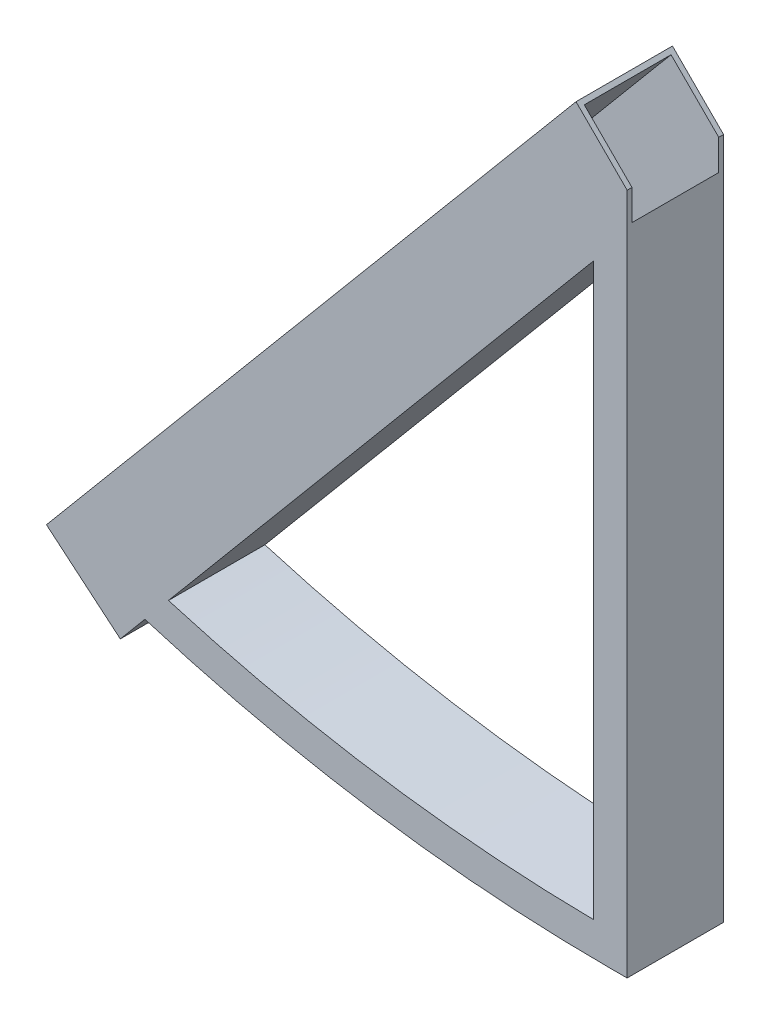
ISO-10303-21;
HEADER;
FILE_DESCRIPTION(('STEP AP214'),'2;1');
FILE_NAME('part.step','',(''),(''),'','','');
FILE_SCHEMA(('AUTOMOTIVE_DESIGN { 1 0 10303 214 1 1 1 1 }'));
ENDSEC;
DATA;
#1=APPLICATION_CONTEXT('core data for automotive mechanical design processes');
#2=APPLICATION_PROTOCOL_DEFINITION('international standard','automotive_design',2000,#1);
#3=PRODUCT_CONTEXT('',#1,'mechanical');
#4=PRODUCT('Part','Part','',(#3));
#5=PRODUCT_RELATED_PRODUCT_CATEGORY('part','',(#4));
#6=PRODUCT_DEFINITION_FORMATION('','',#4);
#7=PRODUCT_DEFINITION_CONTEXT('part definition',#1,'design');
#8=PRODUCT_DEFINITION('design','',#6,#7);
#9=PRODUCT_DEFINITION_SHAPE('','',#8);
#10=(LENGTH_UNIT() NAMED_UNIT(*) SI_UNIT(.MILLI.,.METRE.));
#11=(NAMED_UNIT(*) PLANE_ANGLE_UNIT() SI_UNIT($,.RADIAN.));
#12=(NAMED_UNIT(*) SI_UNIT($,.STERADIAN.) SOLID_ANGLE_UNIT());
#13=UNCERTAINTY_MEASURE_WITH_UNIT(LENGTH_MEASURE(1.E-05),#10,'distance_accuracy_value','');
#14=(GEOMETRIC_REPRESENTATION_CONTEXT(3) GLOBAL_UNCERTAINTY_ASSIGNED_CONTEXT((#13)) GLOBAL_UNIT_ASSIGNED_CONTEXT((#10,
#11,#12)) REPRESENTATION_CONTEXT('',''));
#15=CARTESIAN_POINT('',(0.,0.,0.));
#16=DIRECTION('',(0.,0.,1.));
#17=DIRECTION('',(1.,0.,0.));
#18=AXIS2_PLACEMENT_3D('',#15,#16,#17);
#19=CARTESIAN_POINT('',(0.,330.,-10.));
#20=DIRECTION('',(0.,0.,1.));
#21=DIRECTION('',(1.,0.,0.));
#22=AXIS2_PLACEMENT_3D('',#19,#20,#21);
#23=CYLINDRICAL_SURFACE('',#22,330.);
#24=DIRECTION('',(0.,0.,1.));
#25=VECTOR('',#24,1.);
#26=CARTESIAN_POINT('',(0.,0.,-10.));
#27=LINE('',#26,#25);
#28=CARTESIAN_POINT('',(0.,0.,-10.));
#29=VERTEX_POINT('',#28);
#30=CARTESIAN_POINT('',(0.,0.,10.));
#31=VERTEX_POINT('',#30);
#32=EDGE_CURVE('E279',#29,#31,#27,.T.);
#33=ORIENTED_EDGE('',*,*,#32,.T.);
#34=CARTESIAN_POINT('',(0.,330.,10.));
#35=DIRECTION('',(0.,0.,1.));
#36=DIRECTION('',(-1.,0.,0.));
#37=AXIS2_PLACEMENT_3D('',#34,#35,#36);
#38=CIRCLE('',#37,330.);
#39=CARTESIAN_POINT('',(-96.5092206003725,14.427551362435,10.));
#40=VERTEX_POINT('',#39);
#41=EDGE_CURVE('E202',#40,#31,#38,.T.);
#42=ORIENTED_EDGE('',*,*,#41,.F.);
#43=DIRECTION('',(0.,0.,1.));
#44=VECTOR('',#43,1.);
#45=CARTESIAN_POINT('',(-96.5092206003725,14.427551362435,-10.));
#46=LINE('',#45,#44);
#47=CARTESIAN_POINT('',(-96.5092206003725,14.427551362435,-10.));
#48=VERTEX_POINT('',#47);
#49=EDGE_CURVE('E280',#48,#40,#46,.T.);
#50=ORIENTED_EDGE('',*,*,#49,.F.);
#51=CARTESIAN_POINT('',(0.,330.,-10.));
#52=DIRECTION('',(0.,0.,1.));
#53=DIRECTION('',(-1.,0.,0.));
#54=AXIS2_PLACEMENT_3D('',#51,#52,#53);
#55=CIRCLE('',#54,330.);
#56=EDGE_CURVE('E246',#48,#29,#55,.T.);
#57=ORIENTED_EDGE('',*,*,#56,.T.);
#58=EDGE_LOOP('',(#33,#42,#50,#57));
#59=FACE_BOUND('',#58,.T.);
#60=ADVANCED_FACE('F45',(#59),#23,.T.);
#61=CARTESIAN_POINT('',(-101.613449215523,8.34456857290761,-10.));
#62=DIRECTION('',(0.766044443118983,-0.642787609686533,0.));
#63=DIRECTION('',(0.642787609686534,0.766044443118983,0.));
#64=AXIS2_PLACEMENT_3D('',#61,#62,#63);
#65=PLANE('',#64);
#66=ORIENTED_EDGE('',*,*,#49,.T.);
#67=DIRECTION('',(0.642787609686533,0.766044443118983,0.));
#68=VECTOR('',#67,1.);
#69=CARTESIAN_POINT('',(-101.613449215523,8.34456857290761,10.));
#70=LINE('',#69,#68);
#71=CARTESIAN_POINT('',(-101.613449215523,8.34456857290761,10.));
#72=VERTEX_POINT('',#71);
#73=EDGE_CURVE('E226',#72,#40,#70,.T.);
#74=ORIENTED_EDGE('',*,*,#73,.F.);
#75=DIRECTION('',(0.,0.,1.));
#76=VECTOR('',#75,1.);
#77=CARTESIAN_POINT('',(-101.613449215523,8.34456857290761,-10.));
#78=LINE('',#77,#76);
#79=CARTESIAN_POINT('',(-101.613449215523,8.34456857290761,-10.));
#80=VERTEX_POINT('',#79);
#81=EDGE_CURVE('E284',#80,#72,#78,.T.);
#82=ORIENTED_EDGE('',*,*,#81,.F.);
#83=DIRECTION('',(0.642787609686533,0.766044443118983,0.));
#84=VECTOR('',#83,1.);
#85=CARTESIAN_POINT('',(-101.613449215523,8.34456857290761,-10.));
#86=LINE('',#85,#84);
#87=EDGE_CURVE('E275',#80,#48,#86,.T.);
#88=ORIENTED_EDGE('',*,*,#87,.T.);
#89=EDGE_LOOP('',(#66,#74,#82,#88));
#90=FACE_BOUND('',#89,.T.);
#91=ADVANCED_FACE('F330',(#90),#65,.T.);
#92=CARTESIAN_POINT('',(-116.934338077902,21.2003207666383,-10.));
#93=DIRECTION('',(-0.642787609686534,-0.766044443118982,0.));
#94=DIRECTION('',(0.766044443118982,-0.642787609686534,0.));
#95=AXIS2_PLACEMENT_3D('',#92,#93,#94);
#96=PLANE('',#95);
#97=DIRECTION('',(0.,0.,1.));
#98=VECTOR('',#97,1.);
#99=CARTESIAN_POINT('',(-102.379493658642,8.98735618259415,-10.));
#100=LINE('',#99,#98);
#101=CARTESIAN_POINT('',(-102.379493658642,8.98735618259414,-8.99999999999999));
#102=VERTEX_POINT('',#101);
#103=CARTESIAN_POINT('',(-102.379493658642,8.98735618259414,8.99999999999999));
#104=VERTEX_POINT('',#103);
#105=EDGE_CURVE('E184',#102,#104,#100,.T.);
#106=ORIENTED_EDGE('',*,*,#105,.F.);
#107=DIRECTION('',(0.766044443118982,-0.642787609686534,0.));
#108=VECTOR('',#107,1.);
#109=CARTESIAN_POINT('',(-116.934338077902,21.2003207666383,-8.99999999999999));
#110=LINE('',#109,#108);
#111=CARTESIAN_POINT('',(-116.168293634783,20.5575331569517,-8.99999999999999));
#112=VERTEX_POINT('',#111);
#113=EDGE_CURVE('E181',#112,#102,#110,.T.);
#114=ORIENTED_EDGE('',*,*,#113,.F.);
#115=DIRECTION('',(0.,0.,-1.));
#116=VECTOR('',#115,1.);
#117=CARTESIAN_POINT('',(-116.168293634783,20.5575331569518,-10.));
#118=LINE('',#117,#116);
#119=CARTESIAN_POINT('',(-116.168293634783,20.5575331569518,8.99999999999999));
#120=VERTEX_POINT('',#119);
#121=EDGE_CURVE('E187',#120,#112,#118,.T.);
#122=ORIENTED_EDGE('',*,*,#121,.F.);
#123=DIRECTION('',(-0.766044443118982,0.642787609686534,0.));
#124=VECTOR('',#123,1.);
#125=CARTESIAN_POINT('',(-116.934338077902,21.2003207666383,8.99999999999999));
#126=LINE('',#125,#124);
#127=EDGE_CURVE('E161',#104,#120,#126,.T.);
#128=ORIENTED_EDGE('',*,*,#127,.F.);
#129=EDGE_LOOP('',(#106,#114,#122,#128));
#130=FACE_BOUND('',#129,.T.);
#131=ORIENTED_EDGE('',*,*,#81,.T.);
#132=DIRECTION('',(0.766044443118982,-0.642787609686534,0.));
#133=VECTOR('',#132,1.);
#134=CARTESIAN_POINT('',(-116.934338077902,21.2003207666383,10.));
#135=LINE('',#134,#133);
#136=CARTESIAN_POINT('',(-116.934338077902,21.2003207666383,10.));
#137=VERTEX_POINT('',#136);
#138=EDGE_CURVE('E222',#137,#72,#135,.T.);
#139=ORIENTED_EDGE('',*,*,#138,.F.);
#140=DIRECTION('',(0.,0.,1.));
#141=VECTOR('',#140,1.);
#142=CARTESIAN_POINT('',(-116.934338077902,21.2003207666383,-10.));
#143=LINE('',#142,#141);
#144=CARTESIAN_POINT('',(-116.934338077902,21.2003207666383,-10.));
#145=VERTEX_POINT('',#144);
#146=EDGE_CURVE('E287',#145,#137,#143,.T.);
#147=ORIENTED_EDGE('',*,*,#146,.F.);
#148=DIRECTION('',(0.766044443118982,-0.642787609686534,0.));
#149=VECTOR('',#148,1.);
#150=CARTESIAN_POINT('',(-116.934338077902,21.2003207666383,-10.));
#151=LINE('',#150,#149);
#152=EDGE_CURVE('E271',#145,#80,#151,.T.);
#153=ORIENTED_EDGE('',*,*,#152,.T.);
#154=EDGE_LOOP('',(#131,#139,#147,#153));
#155=FACE_BOUND('',#154,.T.);
#156=ADVANCED_FACE('F334',(#130,#155),#96,.T.);
#157=CARTESIAN_POINT('',(-7.09807814216643,152.098078142165,-10.));
#158=DIRECTION('',(-0.766044443118982,0.642787609686534,0.));
#159=DIRECTION('',(-0.642787609686534,-0.766044443118982,0.));
#160=AXIS2_PLACEMENT_3D('',#157,#158,#159);
#161=PLANE('',#160);
#162=ORIENTED_EDGE('',*,*,#146,.T.);
#163=DIRECTION('',(-0.642787609686534,-0.766044443118982,0.));
#164=VECTOR('',#163,1.);
#165=CARTESIAN_POINT('',(-7.09807814216643,152.098078142165,10.));
#166=LINE('',#165,#164);
#167=CARTESIAN_POINT('',(-7.09807814216643,152.098078142165,10.));
#168=VERTEX_POINT('',#167);
#169=EDGE_CURVE('E218',#168,#137,#166,.T.);
#170=ORIENTED_EDGE('',*,*,#169,.F.);
#171=DIRECTION('',(0.,0.,1.));
#172=VECTOR('',#171,1.);
#173=CARTESIAN_POINT('',(-7.09807814216643,152.098078142165,-10.));
#174=LINE('',#173,#172);
#175=CARTESIAN_POINT('',(-7.09807814216643,152.098078142165,-10.));
#176=VERTEX_POINT('',#175);
#177=EDGE_CURVE('E290',#176,#168,#174,.T.);
#178=ORIENTED_EDGE('',*,*,#177,.F.);
#179=DIRECTION('',(-0.642787609686534,-0.766044443118982,0.));
#180=VECTOR('',#179,1.);
#181=CARTESIAN_POINT('',(-7.09807814216643,152.098078142165,-10.));
#182=LINE('',#181,#180);
#183=EDGE_CURVE('E267',#176,#145,#182,.T.);
#184=ORIENTED_EDGE('',*,*,#183,.T.);
#185=EDGE_LOOP('',(#162,#170,#178,#184));
#186=FACE_BOUND('',#185,.T.);
#187=ADVANCED_FACE('F336',(#186),#161,.T.);
#188=CARTESIAN_POINT('',(3.5,141.499999999998,-10.));
#189=DIRECTION('',(0.707106781186544,0.707106781186551,0.));
#190=DIRECTION('',(-0.707106781186551,0.707106781186544,0.));
#191=AXIS2_PLACEMENT_3D('',#188,#189,#190);
#192=PLANE('',#191);
#193=DIRECTION('',(-0.707106781186551,0.707106781186544,0.));
#194=VECTOR('',#193,1.);
#195=CARTESIAN_POINT('',(3.5,141.499999999998,-8.99999999999999));
#196=LINE('',#195,#194);
#197=CARTESIAN_POINT('',(3.5,141.499999999998,-8.99999999999999));
#198=VERTEX_POINT('',#197);
#199=CARTESIAN_POINT('',(-6.38827032794994,151.388270327948,-8.99999999999999));
#200=VERTEX_POINT('',#199);
#201=EDGE_CURVE('E173',#198,#200,#196,.T.);
#202=ORIENTED_EDGE('',*,*,#201,.F.);
#203=DIRECTION('',(0.,0.,1.));
#204=VECTOR('',#203,1.);
#205=CARTESIAN_POINT('',(3.5,141.499999999998,-10.));
#206=LINE('',#205,#204);
#207=CARTESIAN_POINT('',(3.5,141.499999999998,-10.));
#208=VERTEX_POINT('',#207);
#209=EDGE_CURVE('E293',#208,#198,#206,.T.);
#210=ORIENTED_EDGE('',*,*,#209,.F.);
#211=DIRECTION('',(-0.707106781186551,0.707106781186544,0.));
#212=VECTOR('',#211,1.);
#213=CARTESIAN_POINT('',(3.5,141.499999999998,-10.));
#214=LINE('',#213,#212);
#215=EDGE_CURVE('E263',#208,#176,#214,.T.);
#216=ORIENTED_EDGE('',*,*,#215,.T.);
#217=ORIENTED_EDGE('',*,*,#177,.T.);
#218=DIRECTION('',(-0.707106781186551,0.707106781186544,0.));
#219=VECTOR('',#218,1.);
#220=CARTESIAN_POINT('',(3.5,141.499999999998,10.));
#221=LINE('',#220,#219);
#222=CARTESIAN_POINT('',(3.5,141.499999999998,10.));
#223=VERTEX_POINT('',#222);
#224=EDGE_CURVE('E214',#223,#168,#221,.T.);
#225=ORIENTED_EDGE('',*,*,#224,.F.);
#226=CARTESIAN_POINT('',(3.5,141.499999999998,8.99999999999999));
#227=VERTEX_POINT('',#226);
#228=EDGE_CURVE('E167',#227,#223,#206,.T.);
#229=ORIENTED_EDGE('',*,*,#228,.F.);
#230=DIRECTION('',(0.707106781186551,-0.707106781186544,0.));
#231=VECTOR('',#230,1.);
#232=CARTESIAN_POINT('',(3.5,141.499999999998,8.99999999999999));
#233=LINE('',#232,#231);
#234=CARTESIAN_POINT('',(-6.38827032794994,151.388270327948,8.99999999999999));
#235=VERTEX_POINT('',#234);
#236=EDGE_CURVE('E66',#235,#227,#233,.T.);
#237=ORIENTED_EDGE('',*,*,#236,.F.);
#238=DIRECTION('',(0.,0.,1.));
#239=VECTOR('',#238,1.);
#240=CARTESIAN_POINT('',(-6.38827032794994,151.388270327948,-10.));
#241=LINE('',#240,#239);
#242=EDGE_CURVE('E11',#200,#235,#241,.T.);
#243=ORIENTED_EDGE('',*,*,#242,.F.);
#244=EDGE_LOOP('',(#202,#210,#216,#217,#225,#229,#237,#243));
#245=FACE_BOUND('',#244,.T.);
#246=ADVANCED_FACE('F165',(#245),#192,.T.);
#247=CARTESIAN_POINT('',(3.5,141.499999999998,-10.));
#248=DIRECTION('',(1.,0.,0.));
#249=DIRECTION('',(0.,1.,0.));
#250=AXIS2_PLACEMENT_3D('',#247,#248,#249);
#251=PLANE('',#250);
#252=DIRECTION('',(0.,1.,0.));
#253=VECTOR('',#252,1.);
#254=CARTESIAN_POINT('',(3.5,141.499999999998,-8.99999999999999));
#255=LINE('',#254,#253);
#256=CARTESIAN_POINT('',(3.5,135.169623132338,-8.99999999999999));
#257=VERTEX_POINT('',#256);
#258=EDGE_CURVE('E53',#257,#198,#255,.T.);
#259=ORIENTED_EDGE('',*,*,#258,.F.);
#260=DIRECTION('',(0.,0.,-1.));
#261=VECTOR('',#260,1.);
#262=CARTESIAN_POINT('',(3.5,135.169623132338,-10.));
#263=LINE('',#262,#261);
#264=CARTESIAN_POINT('',(3.5,135.169623132338,8.99999999999999));
#265=VERTEX_POINT('',#264);
#266=EDGE_CURVE('E304',#265,#257,#263,.T.);
#267=ORIENTED_EDGE('',*,*,#266,.F.);
#268=DIRECTION('',(0.,-1.,0.));
#269=VECTOR('',#268,1.);
#270=CARTESIAN_POINT('',(3.5,141.499999999998,8.99999999999999));
#271=LINE('',#270,#269);
#272=EDGE_CURVE('E283',#227,#265,#271,.T.);
#273=ORIENTED_EDGE('',*,*,#272,.F.);
#274=ORIENTED_EDGE('',*,*,#228,.T.);
#275=DIRECTION('',(0.,1.,0.));
#276=VECTOR('',#275,1.);
#277=CARTESIAN_POINT('',(3.5,141.499999999998,10.));
#278=LINE('',#277,#276);
#279=CARTESIAN_POINT('',(3.50000000000001,0.,10.));
#280=VERTEX_POINT('',#279);
#281=EDGE_CURVE('E210',#280,#223,#278,.T.);
#282=ORIENTED_EDGE('',*,*,#281,.F.);
#283=DIRECTION('',(0.,0.,1.));
#284=VECTOR('',#283,1.);
#285=CARTESIAN_POINT('',(3.50000000000001,0.,-10.));
#286=LINE('',#285,#284);
#287=CARTESIAN_POINT('',(3.50000000000001,0.,-10.));
#288=VERTEX_POINT('',#287);
#289=EDGE_CURVE('E297',#288,#280,#286,.T.);
#290=ORIENTED_EDGE('',*,*,#289,.F.);
#291=DIRECTION('',(0.,1.,0.));
#292=VECTOR('',#291,1.);
#293=CARTESIAN_POINT('',(3.5,141.499999999998,-10.));
#294=LINE('',#293,#292);
#295=EDGE_CURVE('E259',#288,#208,#294,.T.);
#296=ORIENTED_EDGE('',*,*,#295,.T.);
#297=ORIENTED_EDGE('',*,*,#209,.T.);
#298=EDGE_LOOP('',(#259,#267,#273,#274,#282,#290,#296,#297));
#299=FACE_BOUND('',#298,.T.);
#300=ADVANCED_FACE('F314',(#299),#251,.T.);
#301=CARTESIAN_POINT('',(3.50000000000001,0.,-10.));
#302=DIRECTION('',(0.,-1.,0.));
#303=DIRECTION('',(1.,0.,0.));
#304=AXIS2_PLACEMENT_3D('',#301,#302,#303);
#305=PLANE('',#304);
#306=ORIENTED_EDGE('',*,*,#289,.T.);
#307=DIRECTION('',(1.,0.,0.));
#308=VECTOR('',#307,1.);
#309=CARTESIAN_POINT('',(3.50000000000001,0.,10.));
#310=LINE('',#309,#308);
#311=EDGE_CURVE('E206',#31,#280,#310,.T.);
#312=ORIENTED_EDGE('',*,*,#311,.F.);
#313=ORIENTED_EDGE('',*,*,#32,.F.);
#314=DIRECTION('',(1.,0.,0.));
#315=VECTOR('',#314,1.);
#316=CARTESIAN_POINT('',(3.50000000000001,0.,-10.));
#317=LINE('',#316,#315);
#318=EDGE_CURVE('E255',#29,#288,#317,.T.);
#319=ORIENTED_EDGE('',*,*,#318,.T.);
#320=EDGE_LOOP('',(#306,#312,#313,#319));
#321=FACE_BOUND('',#320,.T.);
#322=ADVANCED_FACE('F323',(#321),#305,.T.);
#323=CARTESIAN_POINT('',(0.,330.,-10.));
#324=DIRECTION('',(0.,0.,-1.));
#325=DIRECTION('',(-1.,0.,0.));
#326=AXIS2_PLACEMENT_3D('',#323,#324,#325);
#327=PLANE('',#326);
#328=CARTESIAN_POINT('',(0.,330.,-10.));
#329=DIRECTION('',(0.,0.,1.));
#330=DIRECTION('',(1.,0.,0.));
#331=AXIS2_PLACEMENT_3D('',#328,#329,#330);
#332=CIRCLE('',#331,323.01896229169);
#333=CARTESIAN_POINT('',(-91.6250192774077,20.2483158360318,-10.));
#334=VERTEX_POINT('',#333);
#335=CARTESIAN_POINT('',(-3.50000000000001,7.00000000000002,-10.));
#336=VERTEX_POINT('',#335);
#337=EDGE_CURVE('E230',#334,#336,#332,.T.);
#338=ORIENTED_EDGE('',*,*,#337,.T.);
#339=DIRECTION('',(0.,1.,0.));
#340=VECTOR('',#339,1.);
#341=CARTESIAN_POINT('',(-3.50000000000001,7.00000000000002,-10.));
#342=LINE('',#341,#340);
#343=CARTESIAN_POINT('',(-3.49999999999999,125.271624157318,-10.));
#344=VERTEX_POINT('',#343);
#345=EDGE_CURVE('E234',#336,#344,#342,.T.);
#346=ORIENTED_EDGE('',*,*,#345,.T.);
#347=DIRECTION('',(-0.642787609686534,-0.766044443118982,0.));
#348=VECTOR('',#347,1.);
#349=CARTESIAN_POINT('',(-91.6250192774077,20.2483158360318,-10.));
#350=LINE('',#349,#348);
#351=EDGE_CURVE('E238',#344,#334,#350,.T.);
#352=ORIENTED_EDGE('',*,*,#351,.T.);
#353=EDGE_LOOP('',(#338,#346,#352));
#354=FACE_BOUND('',#353,.T.);
#355=ORIENTED_EDGE('',*,*,#56,.F.);
#356=ORIENTED_EDGE('',*,*,#87,.F.);
#357=ORIENTED_EDGE('',*,*,#152,.F.);
#358=ORIENTED_EDGE('',*,*,#183,.F.);
#359=ORIENTED_EDGE('',*,*,#215,.F.);
#360=ORIENTED_EDGE('',*,*,#295,.F.);
#361=ORIENTED_EDGE('',*,*,#318,.F.);
#362=EDGE_LOOP('',(#355,#356,#357,#358,#359,#360,#361));
#363=FACE_BOUND('',#362,.T.);
#364=ADVANCED_FACE('F320',(#354,#363),#327,.T.);
#365=CARTESIAN_POINT('',(0.,330.,-10.));
#366=DIRECTION('',(0.,0.,1.));
#367=DIRECTION('',(1.,0.,0.));
#368=AXIS2_PLACEMENT_3D('',#365,#366,#367);
#369=CYLINDRICAL_SURFACE('',#368,323.01896229169);
#370=DIRECTION('',(0.,0.,1.));
#371=VECTOR('',#370,1.);
#372=CARTESIAN_POINT('',(-91.6250192774077,20.2483158360318,-10.));
#373=LINE('',#372,#371);
#374=CARTESIAN_POINT('',(-91.6250192774077,20.2483158360318,10.));
#375=VERTEX_POINT('',#374);
#376=EDGE_CURVE('E243',#334,#375,#373,.T.);
#377=ORIENTED_EDGE('',*,*,#376,.T.);
#378=CARTESIAN_POINT('',(0.,330.,10.));
#379=DIRECTION('',(0.,0.,1.));
#380=DIRECTION('',(1.,0.,0.));
#381=AXIS2_PLACEMENT_3D('',#378,#379,#380);
#382=CIRCLE('',#381,323.01896229169);
#383=CARTESIAN_POINT('',(-3.50000000000001,7.00000000000002,10.));
#384=VERTEX_POINT('',#383);
#385=EDGE_CURVE('E190',#375,#384,#382,.T.);
#386=ORIENTED_EDGE('',*,*,#385,.T.);
#387=DIRECTION('',(0.,0.,1.));
#388=VECTOR('',#387,1.);
#389=CARTESIAN_POINT('',(-3.50000000000001,7.00000000000002,-10.));
#390=LINE('',#389,#388);
#391=EDGE_CURVE('E242',#336,#384,#390,.T.);
#392=ORIENTED_EDGE('',*,*,#391,.F.);
#393=ORIENTED_EDGE('',*,*,#337,.F.);
#394=EDGE_LOOP('',(#377,#386,#392,#393));
#395=FACE_BOUND('',#394,.T.);
#396=ADVANCED_FACE('F388',(#395),#369,.F.);
#397=CARTESIAN_POINT('',(-91.6250192774077,20.2483158360318,-10.));
#398=DIRECTION('',(-0.766044443118982,0.642787609686534,0.));
#399=DIRECTION('',(-0.642787609686534,-0.766044443118982,0.));
#400=AXIS2_PLACEMENT_3D('',#397,#398,#399);
#401=PLANE('',#400);
#402=DIRECTION('',(0.,0.,1.));
#403=VECTOR('',#402,1.);
#404=CARTESIAN_POINT('',(-3.49999999999999,125.271624157318,-10.));
#405=LINE('',#404,#403);
#406=CARTESIAN_POINT('',(-3.49999999999999,125.271624157318,10.));
#407=VERTEX_POINT('',#406);
#408=EDGE_CURVE('E247',#344,#407,#405,.T.);
#409=ORIENTED_EDGE('',*,*,#408,.T.);
#410=DIRECTION('',(-0.642787609686534,-0.766044443118982,0.));
#411=VECTOR('',#410,1.);
#412=CARTESIAN_POINT('',(-91.6250192774077,20.2483158360318,10.));
#413=LINE('',#412,#411);
#414=EDGE_CURVE('E198',#407,#375,#413,.T.);
#415=ORIENTED_EDGE('',*,*,#414,.T.);
#416=ORIENTED_EDGE('',*,*,#376,.F.);
#417=ORIENTED_EDGE('',*,*,#351,.F.);
#418=EDGE_LOOP('',(#409,#415,#416,#417));
#419=FACE_BOUND('',#418,.T.);
#420=ADVANCED_FACE('F397',(#419),#401,.F.);
#421=CARTESIAN_POINT('',(-3.50000000000001,7.00000000000002,-10.));
#422=DIRECTION('',(1.,0.,0.));
#423=DIRECTION('',(0.,1.,0.));
#424=AXIS2_PLACEMENT_3D('',#421,#422,#423);
#425=PLANE('',#424);
#426=ORIENTED_EDGE('',*,*,#391,.T.);
#427=DIRECTION('',(0.,1.,0.));
#428=VECTOR('',#427,1.);
#429=CARTESIAN_POINT('',(-3.50000000000001,7.00000000000002,10.));
#430=LINE('',#429,#428);
#431=EDGE_CURVE('E194',#384,#407,#430,.T.);
#432=ORIENTED_EDGE('',*,*,#431,.T.);
#433=ORIENTED_EDGE('',*,*,#408,.F.);
#434=ORIENTED_EDGE('',*,*,#345,.F.);
#435=EDGE_LOOP('',(#426,#432,#433,#434));
#436=FACE_BOUND('',#435,.T.);
#437=ADVANCED_FACE('F406',(#436),#425,.F.);
#438=CARTESIAN_POINT('',(0.,330.,10.));
#439=DIRECTION('',(0.,0.,-1.));
#440=DIRECTION('',(-1.,0.,0.));
#441=AXIS2_PLACEMENT_3D('',#438,#439,#440);
#442=PLANE('',#441);
#443=ORIENTED_EDGE('',*,*,#41,.T.);
#444=ORIENTED_EDGE('',*,*,#311,.T.);
#445=ORIENTED_EDGE('',*,*,#281,.T.);
#446=ORIENTED_EDGE('',*,*,#224,.T.);
#447=ORIENTED_EDGE('',*,*,#169,.T.);
#448=ORIENTED_EDGE('',*,*,#138,.T.);
#449=ORIENTED_EDGE('',*,*,#73,.T.);
#450=EDGE_LOOP('',(#443,#444,#445,#446,#447,#448,#449));
#451=FACE_BOUND('',#450,.T.);
#452=ORIENTED_EDGE('',*,*,#385,.F.);
#453=ORIENTED_EDGE('',*,*,#414,.F.);
#454=ORIENTED_EDGE('',*,*,#431,.F.);
#455=EDGE_LOOP('',(#452,#453,#454));
#456=FACE_BOUND('',#455,.T.);
#457=ADVANCED_FACE('F339',(#451,#456),#442,.F.);
#458=CARTESIAN_POINT('',(11.835636870098,145.103648318838,-8.99999999999999));
#459=DIRECTION('',(0.766044443118982,-0.642787609686534,0.));
#460=DIRECTION('',(0.642787609686534,0.766044443118982,0.));
#461=AXIS2_PLACEMENT_3D('',#458,#459,#460);
#462=PLANE('',#461);
#463=ORIENTED_EDGE('',*,*,#105,.T.);
#464=DIRECTION('',(-0.642787609686534,-0.766044443118982,0.));
#465=VECTOR('',#464,1.);
#466=CARTESIAN_POINT('',(11.835636870098,145.103648318838,8.99999999999999));
#467=LINE('',#466,#465);
#468=EDGE_CURVE('E60',#265,#104,#467,.T.);
#469=ORIENTED_EDGE('',*,*,#468,.F.);
#470=ORIENTED_EDGE('',*,*,#266,.T.);
#471=DIRECTION('',(-0.642787609686534,-0.766044443118982,0.));
#472=VECTOR('',#471,1.);
#473=CARTESIAN_POINT('',(11.835636870098,145.103648318838,-8.99999999999999));
#474=LINE('',#473,#472);
#475=EDGE_CURVE('E169',#257,#102,#474,.T.);
#476=ORIENTED_EDGE('',*,*,#475,.T.);
#477=EDGE_LOOP('',(#463,#469,#470,#476));
#478=FACE_BOUND('',#477,.T.);
#479=ADVANCED_FACE('F343',(#478),#462,.F.);
#480=CARTESIAN_POINT('',(-1.95316310604372,156.673825293196,-8.99999999999999));
#481=DIRECTION('',(0.,0.,-1.));
#482=DIRECTION('',(-1.,0.,0.));
#483=AXIS2_PLACEMENT_3D('',#480,#481,#482);
#484=PLANE('',#483);
#485=ORIENTED_EDGE('',*,*,#113,.T.);
#486=ORIENTED_EDGE('',*,*,#475,.F.);
#487=ORIENTED_EDGE('',*,*,#258,.T.);
#488=ORIENTED_EDGE('',*,*,#201,.T.);
#489=DIRECTION('',(-0.642787609686534,-0.766044443118982,0.));
#490=VECTOR('',#489,1.);
#491=CARTESIAN_POINT('',(-1.95316310604372,156.673825293196,-8.99999999999999));
#492=LINE('',#491,#490);
#493=EDGE_CURVE('E156',#200,#112,#492,.T.);
#494=ORIENTED_EDGE('',*,*,#493,.T.);
#495=EDGE_LOOP('',(#485,#486,#487,#488,#494));
#496=FACE_BOUND('',#495,.T.);
#497=ADVANCED_FACE('F310',(#496),#484,.F.);
#498=CARTESIAN_POINT('',(-1.95316310604372,156.673825293196,-8.99999999999999));
#499=DIRECTION('',(-0.766044443118982,0.642787609686534,0.));
#500=DIRECTION('',(-0.642787609686534,-0.766044443118982,0.));
#501=AXIS2_PLACEMENT_3D('',#498,#499,#500);
#502=PLANE('',#501);
#503=ORIENTED_EDGE('',*,*,#121,.T.);
#504=ORIENTED_EDGE('',*,*,#493,.F.);
#505=ORIENTED_EDGE('',*,*,#242,.T.);
#506=DIRECTION('',(-0.642787609686534,-0.766044443118982,0.));
#507=VECTOR('',#506,1.);
#508=CARTESIAN_POINT('',(-1.95316310604372,156.673825293196,8.99999999999999));
#509=LINE('',#508,#507);
#510=EDGE_CURVE('E153',#235,#120,#509,.T.);
#511=ORIENTED_EDGE('',*,*,#510,.T.);
#512=EDGE_LOOP('',(#503,#504,#505,#511));
#513=FACE_BOUND('',#512,.T.);
#514=ADVANCED_FACE('F152',(#513),#502,.F.);
#515=CARTESIAN_POINT('',(-1.95316310604372,156.673825293196,8.99999999999999));
#516=DIRECTION('',(0.,0.,1.));
#517=DIRECTION('',(1.,0.,0.));
#518=AXIS2_PLACEMENT_3D('',#515,#516,#517);
#519=PLANE('',#518);
#520=ORIENTED_EDGE('',*,*,#127,.T.);
#521=ORIENTED_EDGE('',*,*,#510,.F.);
#522=ORIENTED_EDGE('',*,*,#236,.T.);
#523=ORIENTED_EDGE('',*,*,#272,.T.);
#524=ORIENTED_EDGE('',*,*,#468,.T.);
#525=EDGE_LOOP('',(#520,#521,#522,#523,#524));
#526=FACE_BOUND('',#525,.T.);
#527=ADVANCED_FACE('F159',(#526),#519,.F.);
#528=CLOSED_SHELL('',(#60,#91,#156,#187,#246,#300,#322,#364,#396,#420,#437,#457,#479,#497,#514,#527));
#529=MANIFOLD_SOLID_BREP('B2',#528);
#530=ADVANCED_BREP_SHAPE_REPRESENTATION('',(#18,#529),#14);
#531=SHAPE_DEFINITION_REPRESENTATION(#9,#530);
ENDSEC;
END-ISO-10303-21;
